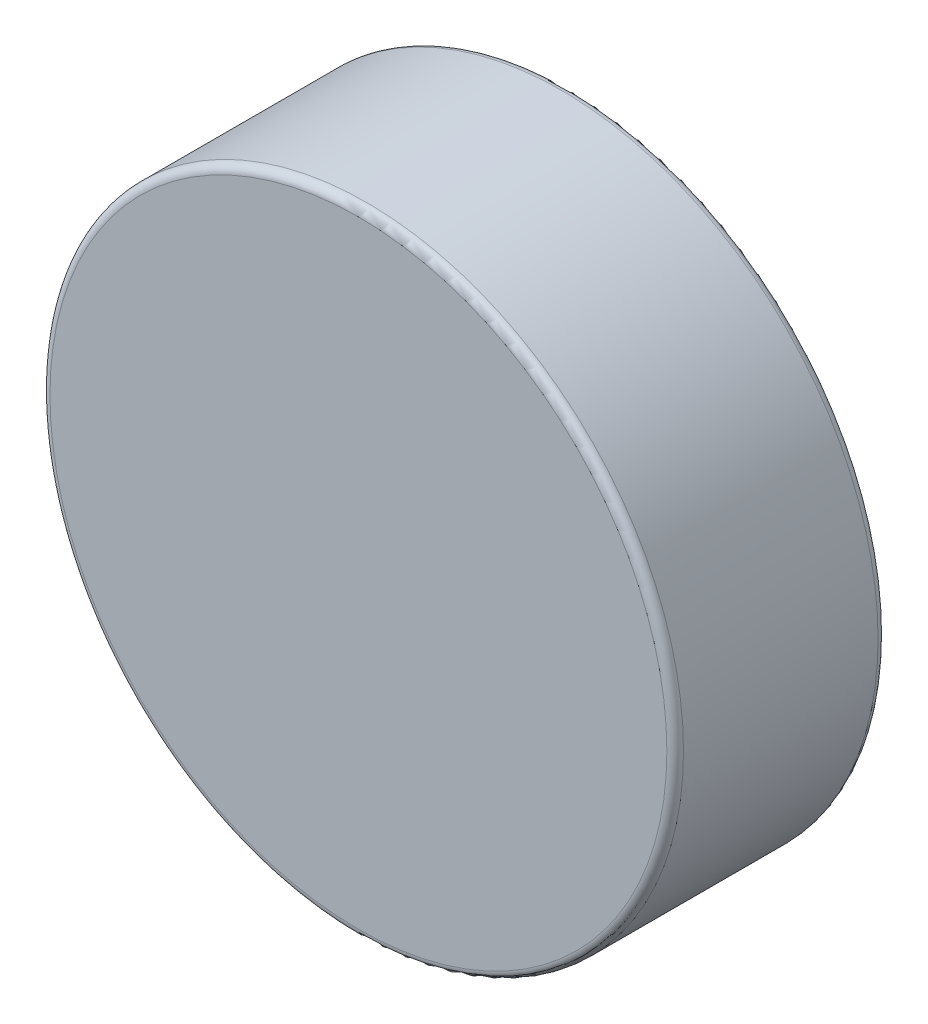
ISO-10303-21;
HEADER;
FILE_DESCRIPTION(('STEP AP214'),'2;1');
FILE_NAME('part.step','',(''),(''),'','','');
FILE_SCHEMA(('AUTOMOTIVE_DESIGN { 1 0 10303 214 1 1 1 1 }'));
ENDSEC;
DATA;
#1=APPLICATION_CONTEXT('core data for automotive mechanical design processes');
#2=APPLICATION_PROTOCOL_DEFINITION('international standard','automotive_design',2000,#1);
#3=PRODUCT_CONTEXT('',#1,'mechanical');
#4=PRODUCT('Part','Part','',(#3));
#5=PRODUCT_RELATED_PRODUCT_CATEGORY('part','',(#4));
#6=PRODUCT_DEFINITION_FORMATION('','',#4);
#7=PRODUCT_DEFINITION_CONTEXT('part definition',#1,'design');
#8=PRODUCT_DEFINITION('design','',#6,#7);
#9=PRODUCT_DEFINITION_SHAPE('','',#8);
#10=(LENGTH_UNIT() NAMED_UNIT(*) SI_UNIT(.MILLI.,.METRE.));
#11=(NAMED_UNIT(*) PLANE_ANGLE_UNIT() SI_UNIT($,.RADIAN.));
#12=(NAMED_UNIT(*) SI_UNIT($,.STERADIAN.) SOLID_ANGLE_UNIT());
#13=UNCERTAINTY_MEASURE_WITH_UNIT(LENGTH_MEASURE(1.E-05),#10,'distance_accuracy_value','');
#14=(GEOMETRIC_REPRESENTATION_CONTEXT(3) GLOBAL_UNCERTAINTY_ASSIGNED_CONTEXT((#13)) GLOBAL_UNIT_ASSIGNED_CONTEXT((#10,
#11,#12)) REPRESENTATION_CONTEXT('',''));
#15=CARTESIAN_POINT('',(0.,0.,0.));
#16=DIRECTION('',(0.,0.,1.));
#17=DIRECTION('',(1.,0.,0.));
#18=AXIS2_PLACEMENT_3D('',#15,#16,#17);
#19=CARTESIAN_POINT('',(0.,0.,25.4));
#20=DIRECTION('',(0.,0.,-1.));
#21=DIRECTION('',(-1.,0.,0.));
#22=AXIS2_PLACEMENT_3D('',#19,#20,#21);
#23=CYLINDRICAL_SURFACE('',#22,38.1);
#24=CARTESIAN_POINT('',(0.,0.,24.4));
#25=DIRECTION('',(0.,0.,1.));
#26=DIRECTION('',(1.,0.,0.));
#27=AXIS2_PLACEMENT_3D('',#24,#25,#26);
#28=CIRCLE('',#27,38.1);
#29=CARTESIAN_POINT('',(38.1,0.,24.4));
#30=VERTEX_POINT('',#29);
#31=EDGE_CURVE('E37',#30,#30,#28,.F.);
#32=ORIENTED_EDGE('',*,*,#31,.T.);
#33=EDGE_LOOP('',(#32));
#34=FACE_BOUND('',#33,.T.);
#35=CARTESIAN_POINT('',(0.,0.,1.));
#36=DIRECTION('',(0.,0.,1.));
#37=DIRECTION('',(1.,0.,0.));
#38=AXIS2_PLACEMENT_3D('',#35,#36,#37);
#39=CIRCLE('',#38,38.1);
#40=CARTESIAN_POINT('',(38.1,0.,1.));
#41=VERTEX_POINT('',#40);
#42=EDGE_CURVE('E41',#41,#41,#39,.T.);
#43=ORIENTED_EDGE('',*,*,#42,.T.);
#44=EDGE_LOOP('',(#43));
#45=FACE_BOUND('',#44,.T.);
#46=ADVANCED_FACE('F30',(#34,#45),#23,.T.);
#47=CARTESIAN_POINT('',(0.,0.,25.4));
#48=DIRECTION('',(0.,0.,1.));
#49=DIRECTION('',(1.,0.,0.));
#50=AXIS2_PLACEMENT_3D('',#47,#48,#49);
#51=PLANE('',#50);
#52=CARTESIAN_POINT('',(0.,0.,25.4));
#53=DIRECTION('',(0.,0.,1.));
#54=DIRECTION('',(1.,0.,0.));
#55=AXIS2_PLACEMENT_3D('',#52,#53,#54);
#56=CIRCLE('',#55,37.1);
#57=CARTESIAN_POINT('',(37.1,0.,25.4));
#58=VERTEX_POINT('',#57);
#59=EDGE_CURVE('E45',#58,#58,#56,.T.);
#60=ORIENTED_EDGE('',*,*,#59,.T.);
#61=EDGE_LOOP('',(#60));
#62=FACE_BOUND('',#61,.T.);
#63=ADVANCED_FACE('F51',(#62),#51,.T.);
#64=CARTESIAN_POINT('',(0.,0.,0.));
#65=DIRECTION('',(0.,0.,1.));
#66=DIRECTION('',(1.,0.,0.));
#67=AXIS2_PLACEMENT_3D('',#64,#65,#66);
#68=PLANE('',#67);
#69=CARTESIAN_POINT('',(0.,0.,0.));
#70=DIRECTION('',(0.,0.,1.));
#71=DIRECTION('',(1.,0.,0.));
#72=AXIS2_PLACEMENT_3D('',#69,#70,#71);
#73=CIRCLE('',#72,37.1);
#74=CARTESIAN_POINT('',(37.1,0.,0.));
#75=VERTEX_POINT('',#74);
#76=EDGE_CURVE('E10',#75,#75,#73,.F.);
#77=ORIENTED_EDGE('',*,*,#76,.T.);
#78=EDGE_LOOP('',(#77));
#79=FACE_BOUND('',#78,.T.);
#80=ADVANCED_FACE('F55',(#79),#68,.F.);
#81=CARTESIAN_POINT('',(0.,0.,24.4));
#82=DIRECTION('',(0.,0.,1.));
#83=DIRECTION('',(1.,0.,0.));
#84=AXIS2_PLACEMENT_3D('',#81,#82,#83);
#85=TOROIDAL_SURFACE('',#84,37.1,1.);
#86=ORIENTED_EDGE('',*,*,#31,.F.);
#87=EDGE_LOOP('',(#86));
#88=FACE_BOUND('',#87,.T.);
#89=ORIENTED_EDGE('',*,*,#59,.F.);
#90=EDGE_LOOP('',(#89));
#91=FACE_BOUND('',#90,.T.);
#92=ADVANCED_FACE('F53',(#88,#91),#85,.T.);
#93=CARTESIAN_POINT('',(0.,0.,1.));
#94=DIRECTION('',(0.,0.,1.));
#95=DIRECTION('',(1.,0.,0.));
#96=AXIS2_PLACEMENT_3D('',#93,#94,#95);
#97=TOROIDAL_SURFACE('',#96,37.1,1.);
#98=ORIENTED_EDGE('',*,*,#76,.F.);
#99=EDGE_LOOP('',(#98));
#100=FACE_BOUND('',#99,.T.);
#101=ORIENTED_EDGE('',*,*,#42,.F.);
#102=EDGE_LOOP('',(#101));
#103=FACE_BOUND('',#102,.T.);
#104=ADVANCED_FACE('F32',(#100,#103),#97,.T.);
#105=CLOSED_SHELL('',(#46,#63,#80,#92,#104));
#106=MANIFOLD_SOLID_BREP('B2',#105);
#107=ADVANCED_BREP_SHAPE_REPRESENTATION('',(#18,#106),#14);
#108=SHAPE_DEFINITION_REPRESENTATION(#9,#107);
ENDSEC;
END-ISO-10303-21;
